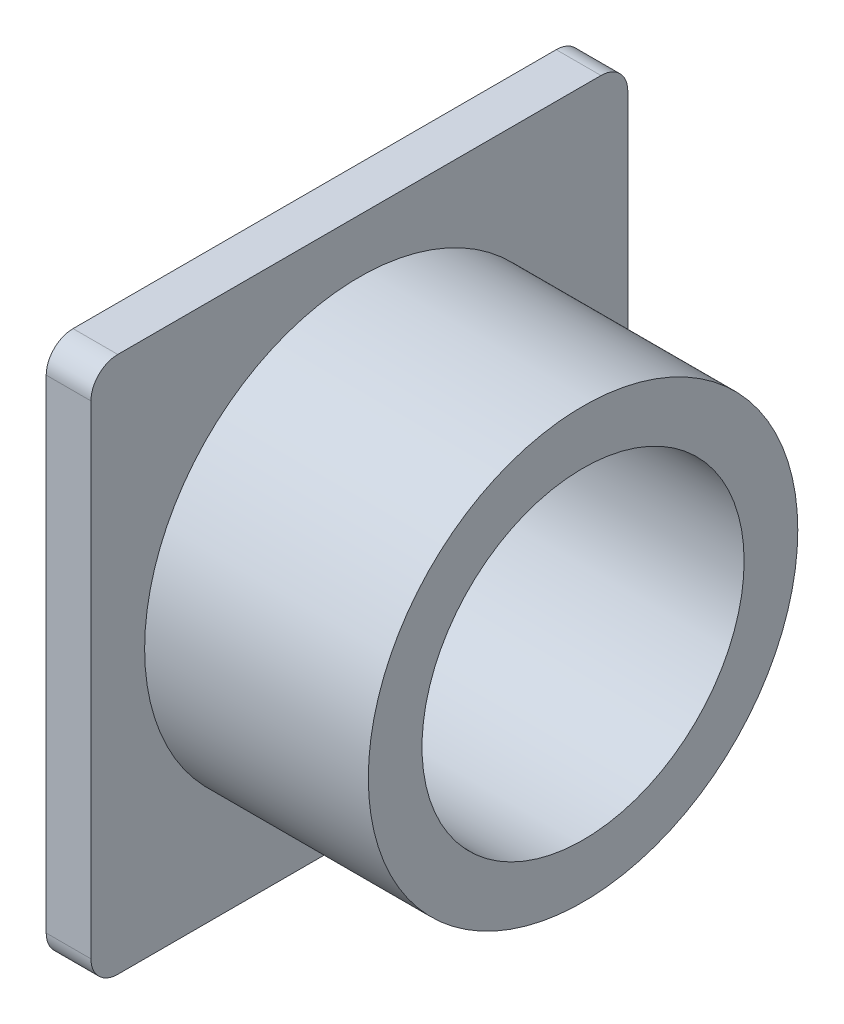
ISO-10303-21;
HEADER;
FILE_DESCRIPTION(('STEP AP214'),'2;1');
FILE_NAME('part.step','',(''),(''),'','','');
FILE_SCHEMA(('AUTOMOTIVE_DESIGN { 1 0 10303 214 1 1 1 1 }'));
ENDSEC;
DATA;
#1=APPLICATION_CONTEXT('core data for automotive mechanical design processes');
#2=APPLICATION_PROTOCOL_DEFINITION('international standard','automotive_design',2000,#1);
#3=PRODUCT_CONTEXT('',#1,'mechanical');
#4=PRODUCT('Part','Part','',(#3));
#5=PRODUCT_RELATED_PRODUCT_CATEGORY('part','',(#4));
#6=PRODUCT_DEFINITION_FORMATION('','',#4);
#7=PRODUCT_DEFINITION_CONTEXT('part definition',#1,'design');
#8=PRODUCT_DEFINITION('design','',#6,#7);
#9=PRODUCT_DEFINITION_SHAPE('','',#8);
#10=(LENGTH_UNIT() NAMED_UNIT(*) SI_UNIT(.MILLI.,.METRE.));
#11=(NAMED_UNIT(*) PLANE_ANGLE_UNIT() SI_UNIT($,.RADIAN.));
#12=(NAMED_UNIT(*) SI_UNIT($,.STERADIAN.) SOLID_ANGLE_UNIT());
#13=UNCERTAINTY_MEASURE_WITH_UNIT(LENGTH_MEASURE(1.E-05),#10,'distance_accuracy_value','');
#14=(GEOMETRIC_REPRESENTATION_CONTEXT(3) GLOBAL_UNCERTAINTY_ASSIGNED_CONTEXT((#13)) GLOBAL_UNIT_ASSIGNED_CONTEXT((#10,
#11,#12)) REPRESENTATION_CONTEXT('',''));
#15=CARTESIAN_POINT('',(0.,0.,0.));
#16=DIRECTION('',(0.,0.,1.));
#17=DIRECTION('',(1.,0.,0.));
#18=AXIS2_PLACEMENT_3D('',#15,#16,#17);
#19=CARTESIAN_POINT('',(5.,0.,0.));
#20=DIRECTION('',(1.,0.,0.));
#21=DIRECTION('',(0.,0.,-1.));
#22=AXIS2_PLACEMENT_3D('',#19,#20,#21);
#23=PLANE('',#22);
#24=CARTESIAN_POINT('',(5.,57.,-3.));
#25=DIRECTION('',(1.,0.,0.));
#26=DIRECTION('',(0.,0.,-1.));
#27=AXIS2_PLACEMENT_3D('',#24,#25,#26);
#28=CIRCLE('',#27,3.);
#29=CARTESIAN_POINT('',(5.,57.,0.));
#30=VERTEX_POINT('',#29);
#31=CARTESIAN_POINT('',(5.,60.,-3.00000000000002));
#32=VERTEX_POINT('',#31);
#33=EDGE_CURVE('E145',#30,#32,#28,.F.);
#34=ORIENTED_EDGE('',*,*,#33,.F.);
#35=DIRECTION('',(0.,1.,0.));
#36=VECTOR('',#35,1.);
#37=CARTESIAN_POINT('',(5.,0.,0.));
#38=LINE('',#37,#36);
#39=CARTESIAN_POINT('',(5.,3.00000000000002,0.));
#40=VERTEX_POINT('',#39);
#41=EDGE_CURVE('E178',#40,#30,#38,.T.);
#42=ORIENTED_EDGE('',*,*,#41,.F.);
#43=CARTESIAN_POINT('',(5.,3.,-3.));
#44=DIRECTION('',(1.,0.,0.));
#45=DIRECTION('',(0.,0.,-1.));
#46=AXIS2_PLACEMENT_3D('',#43,#44,#45);
#47=CIRCLE('',#46,3.);
#48=CARTESIAN_POINT('',(5.,0.,-3.00000000000002));
#49=VERTEX_POINT('',#48);
#50=EDGE_CURVE('E159',#49,#40,#47,.F.);
#51=ORIENTED_EDGE('',*,*,#50,.F.);
#52=DIRECTION('',(0.,0.,-1.));
#53=VECTOR('',#52,1.);
#54=CARTESIAN_POINT('',(5.,0.,0.));
#55=LINE('',#54,#53);
#56=CARTESIAN_POINT('',(5.,0.,-57.));
#57=VERTEX_POINT('',#56);
#58=EDGE_CURVE('E174',#49,#57,#55,.T.);
#59=ORIENTED_EDGE('',*,*,#58,.T.);
#60=CARTESIAN_POINT('',(5.,3.,-57.));
#61=DIRECTION('',(1.,0.,0.));
#62=DIRECTION('',(0.,0.,-1.));
#63=AXIS2_PLACEMENT_3D('',#60,#61,#62);
#64=CIRCLE('',#63,3.);
#65=CARTESIAN_POINT('',(5.,3.00000000000002,-60.));
#66=VERTEX_POINT('',#65);
#67=EDGE_CURVE('E106',#57,#66,#64,.T.);
#68=ORIENTED_EDGE('',*,*,#67,.T.);
#69=DIRECTION('',(0.,1.,0.));
#70=VECTOR('',#69,1.);
#71=CARTESIAN_POINT('',(5.,0.,-60.));
#72=LINE('',#71,#70);
#73=CARTESIAN_POINT('',(5.,57.,-60.));
#74=VERTEX_POINT('',#73);
#75=EDGE_CURVE('E99',#66,#74,#72,.T.);
#76=ORIENTED_EDGE('',*,*,#75,.T.);
#77=CARTESIAN_POINT('',(5.,57.,-57.));
#78=DIRECTION('',(1.,0.,0.));
#79=DIRECTION('',(0.,0.,-1.));
#80=AXIS2_PLACEMENT_3D('',#77,#78,#79);
#81=CIRCLE('',#80,3.);
#82=CARTESIAN_POINT('',(5.,60.,-57.));
#83=VERTEX_POINT('',#82);
#84=EDGE_CURVE('E104',#83,#74,#81,.F.);
#85=ORIENTED_EDGE('',*,*,#84,.F.);
#86=DIRECTION('',(0.,0.,-1.));
#87=VECTOR('',#86,1.);
#88=CARTESIAN_POINT('',(5.,60.,0.));
#89=LINE('',#88,#87);
#90=EDGE_CURVE('E121',#32,#83,#89,.T.);
#91=ORIENTED_EDGE('',*,*,#90,.F.);
#92=EDGE_LOOP('',(#34,#42,#51,#59,#68,#76,#85,#91));
#93=FACE_BOUND('',#92,.T.);
#94=CARTESIAN_POINT('',(5.,30.,-30.));
#95=DIRECTION('',(1.,0.,0.));
#96=DIRECTION('',(0.,0.,-1.));
#97=AXIS2_PLACEMENT_3D('',#94,#95,#96);
#98=CIRCLE('',#97,24.);
#99=CARTESIAN_POINT('',(5.,30.,-54.));
#100=VERTEX_POINT('',#99);
#101=EDGE_CURVE('E181',#100,#100,#98,.T.);
#102=ORIENTED_EDGE('',*,*,#101,.F.);
#103=EDGE_LOOP('',(#102));
#104=FACE_BOUND('',#103,.T.);
#105=ADVANCED_FACE('F32',(#93,#104),#23,.T.);
#106=CARTESIAN_POINT('',(5.,57.,-3.));
#107=DIRECTION('',(-1.,0.,0.));
#108=DIRECTION('',(0.,0.,1.));
#109=AXIS2_PLACEMENT_3D('',#106,#107,#108);
#110=CYLINDRICAL_SURFACE('',#109,3.);
#111=CARTESIAN_POINT('',(0.,57.,-3.));
#112=DIRECTION('',(1.,0.,0.));
#113=DIRECTION('',(0.,0.,-1.));
#114=AXIS2_PLACEMENT_3D('',#111,#112,#113);
#115=CIRCLE('',#114,3.);
#116=CARTESIAN_POINT('',(0.,57.,0.));
#117=VERTEX_POINT('',#116);
#118=CARTESIAN_POINT('',(0.,60.,-3.00000000000002));
#119=VERTEX_POINT('',#118);
#120=EDGE_CURVE('E126',#117,#119,#115,.F.);
#121=ORIENTED_EDGE('',*,*,#120,.F.);
#122=DIRECTION('',(-1.,0.,0.));
#123=VECTOR('',#122,1.);
#124=CARTESIAN_POINT('',(5.,57.,0.));
#125=LINE('',#124,#123);
#126=EDGE_CURVE('E11',#30,#117,#125,.T.);
#127=ORIENTED_EDGE('',*,*,#126,.F.);
#128=ORIENTED_EDGE('',*,*,#33,.T.);
#129=DIRECTION('',(-1.,0.,0.));
#130=VECTOR('',#129,1.);
#131=CARTESIAN_POINT('',(5.,60.,-3.00000000000002));
#132=LINE('',#131,#130);
#133=EDGE_CURVE('E49',#32,#119,#132,.T.);
#134=ORIENTED_EDGE('',*,*,#133,.T.);
#135=EDGE_LOOP('',(#121,#127,#128,#134));
#136=FACE_BOUND('',#135,.T.);
#137=ADVANCED_FACE('F34',(#136),#110,.T.);
#138=CARTESIAN_POINT('',(5.,0.,0.));
#139=DIRECTION('',(0.,0.,1.));
#140=DIRECTION('',(1.,0.,0.));
#141=AXIS2_PLACEMENT_3D('',#138,#139,#140);
#142=PLANE('',#141);
#143=DIRECTION('',(0.,1.,0.));
#144=VECTOR('',#143,1.);
#145=CARTESIAN_POINT('',(0.,0.,0.));
#146=LINE('',#145,#144);
#147=CARTESIAN_POINT('',(0.,3.00000000000002,0.));
#148=VERTEX_POINT('',#147);
#149=EDGE_CURVE('E128',#148,#117,#146,.T.);
#150=ORIENTED_EDGE('',*,*,#149,.F.);
#151=DIRECTION('',(-1.,0.,0.));
#152=VECTOR('',#151,1.);
#153=CARTESIAN_POINT('',(5.,3.00000000000002,0.));
#154=LINE('',#153,#152);
#155=EDGE_CURVE('E41',#40,#148,#154,.T.);
#156=ORIENTED_EDGE('',*,*,#155,.F.);
#157=ORIENTED_EDGE('',*,*,#41,.T.);
#158=ORIENTED_EDGE('',*,*,#126,.T.);
#159=EDGE_LOOP('',(#150,#156,#157,#158));
#160=FACE_BOUND('',#159,.T.);
#161=ADVANCED_FACE('F163',(#160),#142,.T.);
#162=CARTESIAN_POINT('',(5.,3.,-3.));
#163=DIRECTION('',(-1.,0.,0.));
#164=DIRECTION('',(0.,0.,1.));
#165=AXIS2_PLACEMENT_3D('',#162,#163,#164);
#166=CYLINDRICAL_SURFACE('',#165,3.);
#167=CARTESIAN_POINT('',(0.,3.,-3.));
#168=DIRECTION('',(1.,0.,0.));
#169=DIRECTION('',(0.,0.,-1.));
#170=AXIS2_PLACEMENT_3D('',#167,#168,#169);
#171=CIRCLE('',#170,3.);
#172=CARTESIAN_POINT('',(0.,0.,-3.00000000000002));
#173=VERTEX_POINT('',#172);
#174=EDGE_CURVE('E132',#173,#148,#171,.F.);
#175=ORIENTED_EDGE('',*,*,#174,.F.);
#176=DIRECTION('',(-1.,0.,0.));
#177=VECTOR('',#176,1.);
#178=CARTESIAN_POINT('',(5.,0.,-3.00000000000002));
#179=LINE('',#178,#177);
#180=EDGE_CURVE('E152',#49,#173,#179,.T.);
#181=ORIENTED_EDGE('',*,*,#180,.F.);
#182=ORIENTED_EDGE('',*,*,#50,.T.);
#183=ORIENTED_EDGE('',*,*,#155,.T.);
#184=EDGE_LOOP('',(#175,#181,#182,#183));
#185=FACE_BOUND('',#184,.T.);
#186=ADVANCED_FACE('F157',(#185),#166,.T.);
#187=CARTESIAN_POINT('',(5.,0.,0.));
#188=DIRECTION('',(0.,1.,0.));
#189=DIRECTION('',(0.,0.,1.));
#190=AXIS2_PLACEMENT_3D('',#187,#188,#189);
#191=PLANE('',#190);
#192=DIRECTION('',(0.,0.,-1.));
#193=VECTOR('',#192,1.);
#194=CARTESIAN_POINT('',(0.,0.,0.));
#195=LINE('',#194,#193);
#196=CARTESIAN_POINT('',(0.,0.,-57.));
#197=VERTEX_POINT('',#196);
#198=EDGE_CURVE('E135',#173,#197,#195,.T.);
#199=ORIENTED_EDGE('',*,*,#198,.T.);
#200=DIRECTION('',(-1.,0.,0.));
#201=VECTOR('',#200,1.);
#202=CARTESIAN_POINT('',(5.,0.,-57.));
#203=LINE('',#202,#201);
#204=EDGE_CURVE('E149',#57,#197,#203,.T.);
#205=ORIENTED_EDGE('',*,*,#204,.F.);
#206=ORIENTED_EDGE('',*,*,#58,.F.);
#207=ORIENTED_EDGE('',*,*,#180,.T.);
#208=EDGE_LOOP('',(#199,#205,#206,#207));
#209=FACE_BOUND('',#208,.T.);
#210=ADVANCED_FACE('F170',(#209),#191,.F.);
#211=CARTESIAN_POINT('',(5.,3.,-57.));
#212=DIRECTION('',(-1.,0.,0.));
#213=DIRECTION('',(0.,0.,1.));
#214=AXIS2_PLACEMENT_3D('',#211,#212,#213);
#215=CYLINDRICAL_SURFACE('',#214,3.);
#216=CARTESIAN_POINT('',(0.,3.,-57.));
#217=DIRECTION('',(1.,0.,0.));
#218=DIRECTION('',(0.,0.,-1.));
#219=AXIS2_PLACEMENT_3D('',#216,#217,#218);
#220=CIRCLE('',#219,3.);
#221=CARTESIAN_POINT('',(0.,3.00000000000002,-60.));
#222=VERTEX_POINT('',#221);
#223=EDGE_CURVE('E137',#197,#222,#220,.T.);
#224=ORIENTED_EDGE('',*,*,#223,.T.);
#225=DIRECTION('',(-1.,0.,0.));
#226=VECTOR('',#225,1.);
#227=CARTESIAN_POINT('',(5.,3.00000000000002,-60.));
#228=LINE('',#227,#226);
#229=EDGE_CURVE('E118',#66,#222,#228,.T.);
#230=ORIENTED_EDGE('',*,*,#229,.F.);
#231=ORIENTED_EDGE('',*,*,#67,.F.);
#232=ORIENTED_EDGE('',*,*,#204,.T.);
#233=EDGE_LOOP('',(#224,#230,#231,#232));
#234=FACE_BOUND('',#233,.T.);
#235=ADVANCED_FACE('F173',(#234),#215,.T.);
#236=CARTESIAN_POINT('',(5.,0.,-60.));
#237=DIRECTION('',(0.,0.,1.));
#238=DIRECTION('',(1.,0.,0.));
#239=AXIS2_PLACEMENT_3D('',#236,#237,#238);
#240=PLANE('',#239);
#241=DIRECTION('',(0.,1.,0.));
#242=VECTOR('',#241,1.);
#243=CARTESIAN_POINT('',(0.,0.,-60.));
#244=LINE('',#243,#242);
#245=CARTESIAN_POINT('',(0.,57.,-60.));
#246=VERTEX_POINT('',#245);
#247=EDGE_CURVE('E115',#222,#246,#244,.T.);
#248=ORIENTED_EDGE('',*,*,#247,.T.);
#249=DIRECTION('',(-1.,0.,0.));
#250=VECTOR('',#249,1.);
#251=CARTESIAN_POINT('',(5.,57.,-60.));
#252=LINE('',#251,#250);
#253=EDGE_CURVE('E112',#74,#246,#252,.T.);
#254=ORIENTED_EDGE('',*,*,#253,.F.);
#255=ORIENTED_EDGE('',*,*,#75,.F.);
#256=ORIENTED_EDGE('',*,*,#229,.T.);
#257=EDGE_LOOP('',(#248,#254,#255,#256));
#258=FACE_BOUND('',#257,.T.);
#259=ADVANCED_FACE('F113',(#258),#240,.F.);
#260=CARTESIAN_POINT('',(5.,57.,-57.));
#261=DIRECTION('',(-1.,0.,0.));
#262=DIRECTION('',(0.,0.,1.));
#263=AXIS2_PLACEMENT_3D('',#260,#261,#262);
#264=CYLINDRICAL_SURFACE('',#263,3.);
#265=CARTESIAN_POINT('',(0.,57.,-57.));
#266=DIRECTION('',(1.,0.,0.));
#267=DIRECTION('',(0.,0.,-1.));
#268=AXIS2_PLACEMENT_3D('',#265,#266,#267);
#269=CIRCLE('',#268,3.);
#270=CARTESIAN_POINT('',(0.,60.,-57.));
#271=VERTEX_POINT('',#270);
#272=EDGE_CURVE('E140',#271,#246,#269,.F.);
#273=ORIENTED_EDGE('',*,*,#272,.F.);
#274=DIRECTION('',(-1.,0.,0.));
#275=VECTOR('',#274,1.);
#276=CARTESIAN_POINT('',(5.,60.,-57.));
#277=LINE('',#276,#275);
#278=EDGE_CURVE('E74',#83,#271,#277,.T.);
#279=ORIENTED_EDGE('',*,*,#278,.F.);
#280=ORIENTED_EDGE('',*,*,#84,.T.);
#281=ORIENTED_EDGE('',*,*,#253,.T.);
#282=EDGE_LOOP('',(#273,#279,#280,#281));
#283=FACE_BOUND('',#282,.T.);
#284=ADVANCED_FACE('F120',(#283),#264,.T.);
#285=CARTESIAN_POINT('',(5.,60.,0.));
#286=DIRECTION('',(0.,1.,0.));
#287=DIRECTION('',(0.,0.,1.));
#288=AXIS2_PLACEMENT_3D('',#285,#286,#287);
#289=PLANE('',#288);
#290=DIRECTION('',(0.,0.,-1.));
#291=VECTOR('',#290,1.);
#292=CARTESIAN_POINT('',(0.,60.,0.));
#293=LINE('',#292,#291);
#294=EDGE_CURVE('E142',#119,#271,#293,.T.);
#295=ORIENTED_EDGE('',*,*,#294,.F.);
#296=ORIENTED_EDGE('',*,*,#133,.F.);
#297=ORIENTED_EDGE('',*,*,#90,.T.);
#298=ORIENTED_EDGE('',*,*,#278,.T.);
#299=EDGE_LOOP('',(#295,#296,#297,#298));
#300=FACE_BOUND('',#299,.T.);
#301=ADVANCED_FACE('F214',(#300),#289,.T.);
#302=CARTESIAN_POINT('',(0.,0.,0.));
#303=DIRECTION('',(1.,0.,0.));
#304=DIRECTION('',(0.,0.,-1.));
#305=AXIS2_PLACEMENT_3D('',#302,#303,#304);
#306=PLANE('',#305);
#307=CARTESIAN_POINT('',(0.,30.,-30.));
#308=DIRECTION('',(1.,0.,0.));
#309=DIRECTION('',(0.,0.,-1.));
#310=AXIS2_PLACEMENT_3D('',#307,#308,#309);
#311=CIRCLE('',#310,18.);
#312=CARTESIAN_POINT('',(0.,30.,-48.));
#313=VERTEX_POINT('',#312);
#314=EDGE_CURVE('E184',#313,#313,#311,.T.);
#315=ORIENTED_EDGE('',*,*,#314,.T.);
#316=EDGE_LOOP('',(#315));
#317=FACE_BOUND('',#316,.T.);
#318=ORIENTED_EDGE('',*,*,#120,.T.);
#319=ORIENTED_EDGE('',*,*,#294,.T.);
#320=ORIENTED_EDGE('',*,*,#272,.T.);
#321=ORIENTED_EDGE('',*,*,#247,.F.);
#322=ORIENTED_EDGE('',*,*,#223,.F.);
#323=ORIENTED_EDGE('',*,*,#198,.F.);
#324=ORIENTED_EDGE('',*,*,#174,.T.);
#325=ORIENTED_EDGE('',*,*,#149,.T.);
#326=EDGE_LOOP('',(#318,#319,#320,#321,#322,#323,#324,#325));
#327=FACE_BOUND('',#326,.T.);
#328=ADVANCED_FACE('F166',(#317,#327),#306,.F.);
#329=CARTESIAN_POINT('',(30.,30.,-30.));
#330=DIRECTION('',(-1.,0.,0.));
#331=DIRECTION('',(0.,0.,1.));
#332=AXIS2_PLACEMENT_3D('',#329,#330,#331);
#333=CYLINDRICAL_SURFACE('',#332,24.);
#334=CARTESIAN_POINT('',(30.,30.,-30.));
#335=DIRECTION('',(1.,0.,0.));
#336=DIRECTION('',(0.,0.,-1.));
#337=AXIS2_PLACEMENT_3D('',#334,#335,#336);
#338=CIRCLE('',#337,24.);
#339=CARTESIAN_POINT('',(30.,30.,-54.));
#340=VERTEX_POINT('',#339);
#341=EDGE_CURVE('E129',#340,#340,#338,.T.);
#342=ORIENTED_EDGE('',*,*,#341,.F.);
#343=EDGE_LOOP('',(#342));
#344=FACE_BOUND('',#343,.T.);
#345=ORIENTED_EDGE('',*,*,#101,.T.);
#346=EDGE_LOOP('',(#345));
#347=FACE_BOUND('',#346,.T.);
#348=ADVANCED_FACE('F198',(#344,#347),#333,.T.);
#349=CARTESIAN_POINT('',(30.,30.,-30.));
#350=DIRECTION('',(1.,0.,0.));
#351=DIRECTION('',(0.,0.,-1.));
#352=AXIS2_PLACEMENT_3D('',#349,#350,#351);
#353=PLANE('',#352);
#354=CARTESIAN_POINT('',(30.,30.,-30.));
#355=DIRECTION('',(1.,0.,0.));
#356=DIRECTION('',(0.,0.,-1.));
#357=AXIS2_PLACEMENT_3D('',#354,#355,#356);
#358=CIRCLE('',#357,18.);
#359=CARTESIAN_POINT('',(30.,30.,-48.));
#360=VERTEX_POINT('',#359);
#361=EDGE_CURVE('E189',#360,#360,#358,.T.);
#362=ORIENTED_EDGE('',*,*,#361,.F.);
#363=EDGE_LOOP('',(#362));
#364=FACE_BOUND('',#363,.T.);
#365=ORIENTED_EDGE('',*,*,#341,.T.);
#366=EDGE_LOOP('',(#365));
#367=FACE_BOUND('',#366,.T.);
#368=ADVANCED_FACE('F195',(#364,#367),#353,.T.);
#369=CARTESIAN_POINT('',(30.,30.,-30.));
#370=DIRECTION('',(1.,0.,0.));
#371=DIRECTION('',(0.,0.,-1.));
#372=AXIS2_PLACEMENT_3D('',#369,#370,#371);
#373=CYLINDRICAL_SURFACE('',#372,18.);
#374=ORIENTED_EDGE('',*,*,#314,.F.);
#375=EDGE_LOOP('',(#374));
#376=FACE_BOUND('',#375,.T.);
#377=ORIENTED_EDGE('',*,*,#361,.T.);
#378=EDGE_LOOP('',(#377));
#379=FACE_BOUND('',#378,.T.);
#380=ADVANCED_FACE('F193',(#376,#379),#373,.F.);
#381=CLOSED_SHELL('',(#105,#137,#161,#186,#210,#235,#259,#284,#301,#328,#348,#368,#380));
#382=MANIFOLD_SOLID_BREP('B2',#381);
#383=ADVANCED_BREP_SHAPE_REPRESENTATION('',(#18,#382),#14);
#384=SHAPE_DEFINITION_REPRESENTATION(#9,#383);
ENDSEC;
END-ISO-10303-21;
